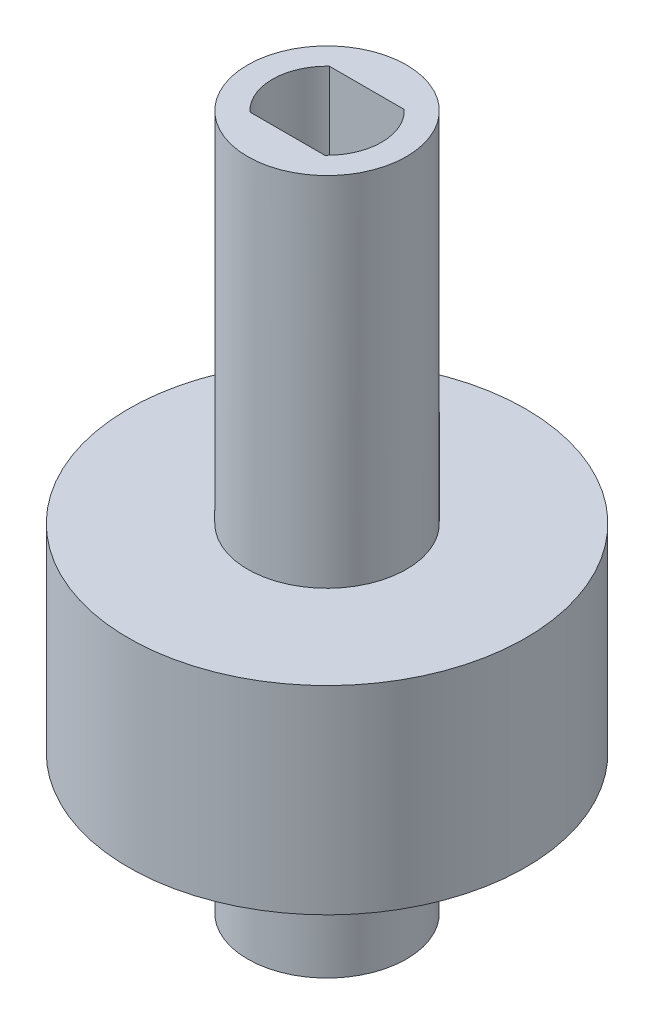
ISO-10303-21;
HEADER;
FILE_DESCRIPTION(('STEP AP214'),'2;1');
FILE_NAME('part.step','',(''),(''),'','','');
FILE_SCHEMA(('AUTOMOTIVE_DESIGN { 1 0 10303 214 1 1 1 1 }'));
ENDSEC;
DATA;
#1=APPLICATION_CONTEXT('core data for automotive mechanical design processes');
#2=APPLICATION_PROTOCOL_DEFINITION('international standard','automotive_design',2000,#1);
#3=PRODUCT_CONTEXT('',#1,'mechanical');
#4=PRODUCT('Part','Part','',(#3));
#5=PRODUCT_RELATED_PRODUCT_CATEGORY('part','',(#4));
#6=PRODUCT_DEFINITION_FORMATION('','',#4);
#7=PRODUCT_DEFINITION_CONTEXT('part definition',#1,'design');
#8=PRODUCT_DEFINITION('design','',#6,#7);
#9=PRODUCT_DEFINITION_SHAPE('','',#8);
#10=(LENGTH_UNIT() NAMED_UNIT(*) SI_UNIT(.MILLI.,.METRE.));
#11=(NAMED_UNIT(*) PLANE_ANGLE_UNIT() SI_UNIT($,.RADIAN.));
#12=(NAMED_UNIT(*) SI_UNIT($,.STERADIAN.) SOLID_ANGLE_UNIT());
#13=UNCERTAINTY_MEASURE_WITH_UNIT(LENGTH_MEASURE(1.E-05),#10,'distance_accuracy_value','');
#14=(GEOMETRIC_REPRESENTATION_CONTEXT(3) GLOBAL_UNCERTAINTY_ASSIGNED_CONTEXT((#13)) GLOBAL_UNIT_ASSIGNED_CONTEXT((#10,
#11,#12)) REPRESENTATION_CONTEXT('',''));
#15=CARTESIAN_POINT('',(0.,0.,0.));
#16=DIRECTION('',(0.,0.,1.));
#17=DIRECTION('',(1.,0.,0.));
#18=AXIS2_PLACEMENT_3D('',#15,#16,#17);
#19=CARTESIAN_POINT('',(0.,35.,0.));
#20=DIRECTION('',(0.,-1.,0.));
#21=DIRECTION('',(0.,0.,-1.));
#22=AXIS2_PLACEMENT_3D('',#19,#20,#21);
#23=CYLINDRICAL_SURFACE('',#22,4.);
#24=CARTESIAN_POINT('',(0.,35.,0.));
#25=DIRECTION('',(0.,1.,0.));
#26=DIRECTION('',(0.,0.,1.));
#27=AXIS2_PLACEMENT_3D('',#24,#25,#26);
#28=CIRCLE('',#27,4.);
#29=CARTESIAN_POINT('',(0.,35.,4.));
#30=VERTEX_POINT('',#29);
#31=EDGE_CURVE('E49',#30,#30,#28,.T.);
#32=ORIENTED_EDGE('',*,*,#31,.F.);
#33=EDGE_LOOP('',(#32));
#34=FACE_BOUND('',#33,.T.);
#35=CARTESIAN_POINT('',(0.,17.,0.));
#36=DIRECTION('',(0.,-1.,0.));
#37=DIRECTION('',(0.,0.,-1.));
#38=AXIS2_PLACEMENT_3D('',#35,#36,#37);
#39=CIRCLE('',#38,4.);
#40=CARTESIAN_POINT('',(0.,17.,-4.));
#41=VERTEX_POINT('',#40);
#42=EDGE_CURVE('E11',#41,#41,#39,.T.);
#43=ORIENTED_EDGE('',*,*,#42,.F.);
#44=EDGE_LOOP('',(#43));
#45=FACE_BOUND('',#44,.T.);
#46=ADVANCED_FACE('F41',(#34,#45),#23,.T.);
#47=CARTESIAN_POINT('',(0.,35.,0.));
#48=DIRECTION('',(0.,1.,0.));
#49=DIRECTION('',(0.,0.,1.));
#50=AXIS2_PLACEMENT_3D('',#47,#48,#49);
#51=PLANE('',#50);
#52=CARTESIAN_POINT('',(0.,35.,0.));
#53=DIRECTION('',(0.,1.,0.));
#54=DIRECTION('',(0.,0.,1.));
#55=AXIS2_PLACEMENT_3D('',#52,#53,#54);
#56=CIRCLE('',#55,2.75);
#57=CARTESIAN_POINT('',(1.88745860881769,35.,2.));
#58=VERTEX_POINT('',#57);
#59=CARTESIAN_POINT('',(1.88745860881769,35.,-2.));
#60=VERTEX_POINT('',#59);
#61=EDGE_CURVE('E56',#58,#60,#56,.T.);
#62=ORIENTED_EDGE('',*,*,#61,.F.);
#63=DIRECTION('',(1.,0.,0.));
#64=VECTOR('',#63,1.);
#65=CARTESIAN_POINT('',(-1.88745860881769,35.,2.));
#66=LINE('',#65,#64);
#67=CARTESIAN_POINT('',(-1.88745860881769,35.,2.));
#68=VERTEX_POINT('',#67);
#69=EDGE_CURVE('E107',#68,#58,#66,.T.);
#70=ORIENTED_EDGE('',*,*,#69,.F.);
#71=CARTESIAN_POINT('',(0.,35.,0.));
#72=DIRECTION('',(0.,1.,0.));
#73=DIRECTION('',(0.,0.,1.));
#74=AXIS2_PLACEMENT_3D('',#71,#72,#73);
#75=CIRCLE('',#74,2.75);
#76=CARTESIAN_POINT('',(-1.88745860881769,35.,-2.));
#77=VERTEX_POINT('',#76);
#78=EDGE_CURVE('E115',#77,#68,#75,.T.);
#79=ORIENTED_EDGE('',*,*,#78,.F.);
#80=DIRECTION('',(-1.,0.,0.));
#81=VECTOR('',#80,1.);
#82=CARTESIAN_POINT('',(-1.88745860881769,35.,-2.));
#83=LINE('',#82,#81);
#84=EDGE_CURVE('E91',#60,#77,#83,.T.);
#85=ORIENTED_EDGE('',*,*,#84,.F.);
#86=EDGE_LOOP('',(#62,#70,#79,#85));
#87=FACE_BOUND('',#86,.T.);
#88=ORIENTED_EDGE('',*,*,#31,.T.);
#89=EDGE_LOOP('',(#88));
#90=FACE_BOUND('',#89,.T.);
#91=ADVANCED_FACE('F142',(#87,#90),#51,.T.);
#92=CARTESIAN_POINT('',(0.,25.,0.));
#93=DIRECTION('',(0.,1.,0.));
#94=DIRECTION('',(0.,0.,1.));
#95=AXIS2_PLACEMENT_3D('',#92,#93,#94);
#96=CYLINDRICAL_SURFACE('',#95,2.75);
#97=ORIENTED_EDGE('',*,*,#61,.T.);
#98=DIRECTION('',(0.,1.,0.));
#99=VECTOR('',#98,1.);
#100=CARTESIAN_POINT('',(1.88745860881769,25.,-2.));
#101=LINE('',#100,#99);
#102=CARTESIAN_POINT('',(1.88745860881769,25.,-2.));
#103=VERTEX_POINT('',#102);
#104=EDGE_CURVE('E79',#103,#60,#101,.T.);
#105=ORIENTED_EDGE('',*,*,#104,.F.);
#106=CARTESIAN_POINT('',(0.,25.,0.));
#107=DIRECTION('',(0.,1.,0.));
#108=DIRECTION('',(0.,0.,1.));
#109=AXIS2_PLACEMENT_3D('',#106,#107,#108);
#110=CIRCLE('',#109,2.75);
#111=CARTESIAN_POINT('',(1.88745860881769,25.,2.));
#112=VERTEX_POINT('',#111);
#113=EDGE_CURVE('E105',#112,#103,#110,.T.);
#114=ORIENTED_EDGE('',*,*,#113,.F.);
#115=DIRECTION('',(0.,1.,0.));
#116=VECTOR('',#115,1.);
#117=CARTESIAN_POINT('',(1.88745860881769,25.,2.));
#118=LINE('',#117,#116);
#119=EDGE_CURVE('E64',#112,#58,#118,.T.);
#120=ORIENTED_EDGE('',*,*,#119,.T.);
#121=EDGE_LOOP('',(#97,#105,#114,#120));
#122=FACE_BOUND('',#121,.T.);
#123=ADVANCED_FACE('F147',(#122),#96,.F.);
#124=CARTESIAN_POINT('',(-1.88745860881769,25.,2.));
#125=DIRECTION('',(0.,0.,1.));
#126=DIRECTION('',(1.,0.,0.));
#127=AXIS2_PLACEMENT_3D('',#124,#125,#126);
#128=PLANE('',#127);
#129=ORIENTED_EDGE('',*,*,#69,.T.);
#130=ORIENTED_EDGE('',*,*,#119,.F.);
#131=DIRECTION('',(1.,0.,0.));
#132=VECTOR('',#131,1.);
#133=CARTESIAN_POINT('',(-1.88745860881769,25.,2.));
#134=LINE('',#133,#132);
#135=CARTESIAN_POINT('',(-1.88745860881769,25.,2.));
#136=VERTEX_POINT('',#135);
#137=EDGE_CURVE('E102',#136,#112,#134,.T.);
#138=ORIENTED_EDGE('',*,*,#137,.F.);
#139=DIRECTION('',(0.,1.,0.));
#140=VECTOR('',#139,1.);
#141=CARTESIAN_POINT('',(-1.88745860881769,25.,2.));
#142=LINE('',#141,#140);
#143=EDGE_CURVE('E95',#136,#68,#142,.T.);
#144=ORIENTED_EDGE('',*,*,#143,.T.);
#145=EDGE_LOOP('',(#129,#130,#138,#144));
#146=FACE_BOUND('',#145,.T.);
#147=ADVANCED_FACE('F187',(#146),#128,.F.);
#148=CARTESIAN_POINT('',(0.,25.,0.));
#149=DIRECTION('',(0.,1.,0.));
#150=DIRECTION('',(0.,0.,1.));
#151=AXIS2_PLACEMENT_3D('',#148,#149,#150);
#152=CYLINDRICAL_SURFACE('',#151,2.75);
#153=ORIENTED_EDGE('',*,*,#78,.T.);
#154=ORIENTED_EDGE('',*,*,#143,.F.);
#155=CARTESIAN_POINT('',(0.,25.,0.));
#156=DIRECTION('',(0.,1.,0.));
#157=DIRECTION('',(0.,0.,1.));
#158=AXIS2_PLACEMENT_3D('',#155,#156,#157);
#159=CIRCLE('',#158,2.75);
#160=CARTESIAN_POINT('',(-1.88745860881769,25.,-2.));
#161=VERTEX_POINT('',#160);
#162=EDGE_CURVE('E98',#161,#136,#159,.T.);
#163=ORIENTED_EDGE('',*,*,#162,.F.);
#164=DIRECTION('',(0.,1.,0.));
#165=VECTOR('',#164,1.);
#166=CARTESIAN_POINT('',(-1.88745860881769,25.,-2.));
#167=LINE('',#166,#165);
#168=EDGE_CURVE('E84',#161,#77,#167,.T.);
#169=ORIENTED_EDGE('',*,*,#168,.T.);
#170=EDGE_LOOP('',(#153,#154,#163,#169));
#171=FACE_BOUND('',#170,.T.);
#172=ADVANCED_FACE('F99',(#171),#152,.F.);
#173=CARTESIAN_POINT('',(-1.88745860881769,25.,-2.));
#174=DIRECTION('',(0.,0.,-1.));
#175=DIRECTION('',(-1.,0.,0.));
#176=AXIS2_PLACEMENT_3D('',#173,#174,#175);
#177=PLANE('',#176);
#178=ORIENTED_EDGE('',*,*,#84,.T.);
#179=ORIENTED_EDGE('',*,*,#168,.F.);
#180=DIRECTION('',(-1.,0.,0.));
#181=VECTOR('',#180,1.);
#182=CARTESIAN_POINT('',(-1.88745860881769,25.,-2.));
#183=LINE('',#182,#181);
#184=EDGE_CURVE('E88',#103,#161,#183,.T.);
#185=ORIENTED_EDGE('',*,*,#184,.F.);
#186=ORIENTED_EDGE('',*,*,#104,.T.);
#187=EDGE_LOOP('',(#178,#179,#185,#186));
#188=FACE_BOUND('',#187,.T.);
#189=ADVANCED_FACE('F86',(#188),#177,.F.);
#190=CARTESIAN_POINT('',(0.,25.,0.));
#191=DIRECTION('',(0.,1.,0.));
#192=DIRECTION('',(0.,0.,1.));
#193=AXIS2_PLACEMENT_3D('',#190,#191,#192);
#194=PLANE('',#193);
#195=ORIENTED_EDGE('',*,*,#113,.T.);
#196=ORIENTED_EDGE('',*,*,#184,.T.);
#197=ORIENTED_EDGE('',*,*,#162,.T.);
#198=ORIENTED_EDGE('',*,*,#137,.T.);
#199=EDGE_LOOP('',(#195,#196,#197,#198));
#200=FACE_BOUND('',#199,.T.);
#201=ADVANCED_FACE('F104',(#200),#194,.T.);
#202=CARTESIAN_POINT('',(0.,17.,0.));
#203=DIRECTION('',(0.,-1.,0.));
#204=DIRECTION('',(0.,0.,-1.));
#205=AXIS2_PLACEMENT_3D('',#202,#203,#204);
#206=CYLINDRICAL_SURFACE('',#205,10.);
#207=CARTESIAN_POINT('',(0.,17.,0.));
#208=DIRECTION('',(0.,-1.,0.));
#209=DIRECTION('',(0.,0.,-1.));
#210=AXIS2_PLACEMENT_3D('',#207,#208,#209);
#211=CIRCLE('',#210,10.);
#212=CARTESIAN_POINT('',(0.,17.,-10.));
#213=VERTEX_POINT('',#212);
#214=EDGE_CURVE('E161',#213,#213,#211,.T.);
#215=ORIENTED_EDGE('',*,*,#214,.T.);
#216=EDGE_LOOP('',(#215));
#217=FACE_BOUND('',#216,.T.);
#218=CARTESIAN_POINT('',(0.,7.,0.));
#219=DIRECTION('',(0.,-1.,0.));
#220=DIRECTION('',(0.,0.,-1.));
#221=AXIS2_PLACEMENT_3D('',#218,#219,#220);
#222=CIRCLE('',#221,10.);
#223=CARTESIAN_POINT('',(0.,7.,-10.));
#224=VERTEX_POINT('',#223);
#225=EDGE_CURVE('E164',#224,#224,#222,.T.);
#226=ORIENTED_EDGE('',*,*,#225,.F.);
#227=EDGE_LOOP('',(#226));
#228=FACE_BOUND('',#227,.T.);
#229=ADVANCED_FACE('F157',(#217,#228),#206,.T.);
#230=CARTESIAN_POINT('',(0.,17.,0.));
#231=DIRECTION('',(0.,-1.,0.));
#232=DIRECTION('',(0.,0.,-1.));
#233=AXIS2_PLACEMENT_3D('',#230,#231,#232);
#234=PLANE('',#233);
#235=ORIENTED_EDGE('',*,*,#42,.T.);
#236=EDGE_LOOP('',(#235));
#237=FACE_BOUND('',#236,.T.);
#238=ORIENTED_EDGE('',*,*,#214,.F.);
#239=EDGE_LOOP('',(#238));
#240=FACE_BOUND('',#239,.T.);
#241=ADVANCED_FACE('F153',(#237,#240),#234,.F.);
#242=CARTESIAN_POINT('',(0.,7.,0.));
#243=DIRECTION('',(0.,-1.,0.));
#244=DIRECTION('',(0.,0.,-1.));
#245=AXIS2_PLACEMENT_3D('',#242,#243,#244);
#246=PLANE('',#245);
#247=CARTESIAN_POINT('',(0.,7.,0.));
#248=DIRECTION('',(0.,-1.,0.));
#249=DIRECTION('',(0.,0.,-1.));
#250=AXIS2_PLACEMENT_3D('',#247,#248,#249);
#251=CIRCLE('',#250,4.);
#252=CARTESIAN_POINT('',(0.,7.,-4.));
#253=VERTEX_POINT('',#252);
#254=EDGE_CURVE('E168',#253,#253,#251,.T.);
#255=ORIENTED_EDGE('',*,*,#254,.F.);
#256=EDGE_LOOP('',(#255));
#257=FACE_BOUND('',#256,.T.);
#258=ORIENTED_EDGE('',*,*,#225,.T.);
#259=EDGE_LOOP('',(#258));
#260=FACE_BOUND('',#259,.T.);
#261=ADVANCED_FACE('F156',(#257,#260),#246,.T.);
#262=CARTESIAN_POINT('',(0.,15.,0.));
#263=DIRECTION('',(0.,-1.,0.));
#264=DIRECTION('',(0.,0.,-1.));
#265=AXIS2_PLACEMENT_3D('',#262,#263,#264);
#266=PLANE('',#265);
#267=CARTESIAN_POINT('',(0.,15.,0.));
#268=DIRECTION('',(0.,-1.,0.));
#269=DIRECTION('',(0.,0.,-1.));
#270=AXIS2_PLACEMENT_3D('',#267,#268,#269);
#271=CIRCLE('',#270,2.4);
#272=CARTESIAN_POINT('',(0.,15.,-2.4));
#273=VERTEX_POINT('',#272);
#274=EDGE_CURVE('E113',#273,#273,#271,.T.);
#275=ORIENTED_EDGE('',*,*,#274,.T.);
#276=EDGE_LOOP('',(#275));
#277=FACE_BOUND('',#276,.T.);
#278=ADVANCED_FACE('F136',(#277),#266,.T.);
#279=CARTESIAN_POINT('',(0.,15.,0.));
#280=DIRECTION('',(0.,-1.,0.));
#281=DIRECTION('',(0.,0.,-1.));
#282=AXIS2_PLACEMENT_3D('',#279,#280,#281);
#283=CYLINDRICAL_SURFACE('',#282,2.4);
#284=ORIENTED_EDGE('',*,*,#274,.F.);
#285=EDGE_LOOP('',(#284));
#286=FACE_BOUND('',#285,.T.);
#287=CARTESIAN_POINT('',(0.,0.,0.));
#288=DIRECTION('',(0.,-1.,0.));
#289=DIRECTION('',(0.,0.,-1.));
#290=AXIS2_PLACEMENT_3D('',#287,#288,#289);
#291=CIRCLE('',#290,2.4);
#292=CARTESIAN_POINT('',(0.,0.,-2.4));
#293=VERTEX_POINT('',#292);
#294=EDGE_CURVE('E163',#293,#293,#291,.T.);
#295=ORIENTED_EDGE('',*,*,#294,.T.);
#296=EDGE_LOOP('',(#295));
#297=FACE_BOUND('',#296,.T.);
#298=ADVANCED_FACE('F129',(#286,#297),#283,.F.);
#299=CARTESIAN_POINT('',(0.,0.,0.));
#300=DIRECTION('',(0.,1.,0.));
#301=DIRECTION('',(0.,0.,1.));
#302=AXIS2_PLACEMENT_3D('',#299,#300,#301);
#303=PLANE('',#302);
#304=ORIENTED_EDGE('',*,*,#294,.F.);
#305=EDGE_LOOP('',(#304));
#306=FACE_BOUND('',#305,.T.);
#307=CARTESIAN_POINT('',(0.,0.,0.));
#308=DIRECTION('',(0.,1.,0.));
#309=DIRECTION('',(0.,0.,1.));
#310=AXIS2_PLACEMENT_3D('',#307,#308,#309);
#311=CIRCLE('',#310,4.);
#312=CARTESIAN_POINT('',(0.,0.,4.));
#313=VERTEX_POINT('',#312);
#314=EDGE_CURVE('E119',#313,#313,#311,.T.);
#315=ORIENTED_EDGE('',*,*,#314,.F.);
#316=EDGE_LOOP('',(#315));
#317=FACE_BOUND('',#316,.T.);
#318=ADVANCED_FACE('F127',(#306,#317),#303,.F.);
#319=ORIENTED_EDGE('',*,*,#254,.T.);
#320=EDGE_LOOP('',(#319));
#321=FACE_BOUND('',#320,.T.);
#322=ORIENTED_EDGE('',*,*,#314,.T.);
#323=EDGE_LOOP('',(#322));
#324=FACE_BOUND('',#323,.T.);
#325=ADVANCED_FACE('F43',(#321,#324),#23,.T.);
#326=CLOSED_SHELL('',(#46,#91,#123,#147,#172,#189,#201,#229,#241,#261,#278,#298,#318,#325));
#327=MANIFOLD_SOLID_BREP('B2',#326);
#328=ADVANCED_BREP_SHAPE_REPRESENTATION('',(#18,#327),#14);
#329=SHAPE_DEFINITION_REPRESENTATION(#9,#328);
ENDSEC;
END-ISO-10303-21;
